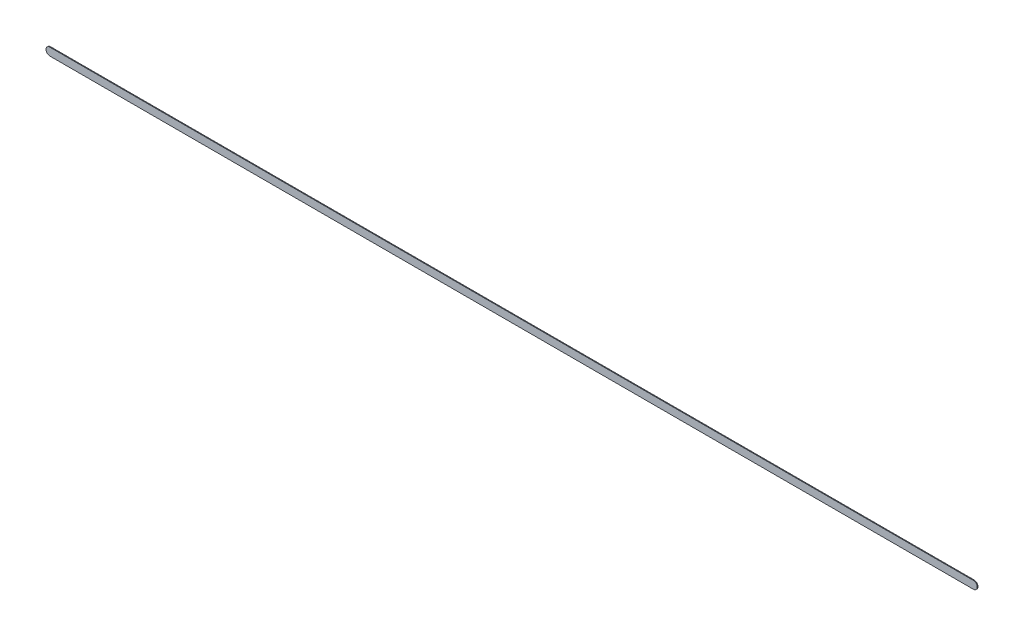
ISO-10303-21;
HEADER;
FILE_DESCRIPTION(('STEP AP214'),'2;1');
FILE_NAME('part.step','',(''),(''),'','','');
FILE_SCHEMA(('AUTOMOTIVE_DESIGN { 1 0 10303 214 1 1 1 1 }'));
ENDSEC;
DATA;
#1=APPLICATION_CONTEXT('core data for automotive mechanical design processes');
#2=APPLICATION_PROTOCOL_DEFINITION('international standard','automotive_design',2000,#1);
#3=PRODUCT_CONTEXT('',#1,'mechanical');
#4=PRODUCT('Part','Part','',(#3));
#5=PRODUCT_RELATED_PRODUCT_CATEGORY('part','',(#4));
#6=PRODUCT_DEFINITION_FORMATION('','',#4);
#7=PRODUCT_DEFINITION_CONTEXT('part definition',#1,'design');
#8=PRODUCT_DEFINITION('design','',#6,#7);
#9=PRODUCT_DEFINITION_SHAPE('','',#8);
#10=(LENGTH_UNIT() NAMED_UNIT(*) SI_UNIT(.MILLI.,.METRE.));
#11=(NAMED_UNIT(*) PLANE_ANGLE_UNIT() SI_UNIT($,.RADIAN.));
#12=(NAMED_UNIT(*) SI_UNIT($,.STERADIAN.) SOLID_ANGLE_UNIT());
#13=UNCERTAINTY_MEASURE_WITH_UNIT(LENGTH_MEASURE(1.E-05),#10,'distance_accuracy_value','');
#14=(GEOMETRIC_REPRESENTATION_CONTEXT(3) GLOBAL_UNCERTAINTY_ASSIGNED_CONTEXT((#13)) GLOBAL_UNIT_ASSIGNED_CONTEXT((#10,
#11,#12)) REPRESENTATION_CONTEXT('',''));
#15=CARTESIAN_POINT('',(0.,0.,0.));
#16=DIRECTION('',(0.,0.,1.));
#17=DIRECTION('',(1.,0.,0.));
#18=AXIS2_PLACEMENT_3D('',#15,#16,#17);
#19=CARTESIAN_POINT('',(31.987498780831,40.574998779297,1.1723000001));
#20=DIRECTION('',(0.,0.,1.));
#21=DIRECTION('',(1.,0.,0.));
#22=AXIS2_PLACEMENT_3D('',#19,#20,#21);
#23=PLANE('',#22);
#24=CARTESIAN_POINT('',(24.387498779297,40.574998779297,1.1723000001));
#25=DIRECTION('',(0.,0.,-1.));
#26=DIRECTION('',(1.,0.,0.));
#27=AXIS2_PLACEMENT_3D('',#24,#25,#26);
#28=CIRCLE('',#27,0.06349975587111);
#29=CARTESIAN_POINT('',(24.387499389648,40.511499023438,1.1723000001));
#30=VERTEX_POINT('',#29);
#31=CARTESIAN_POINT('',(24.387498779297,40.638498535162,1.1723000001));
#32=VERTEX_POINT('',#31);
#33=EDGE_CURVE('E47',#30,#32,#28,.T.);
#34=ORIENTED_EDGE('',*,*,#33,.F.);
#35=DIRECTION('',(1.,0.,0.));
#36=VECTOR('',#35,1.);
#37=CARTESIAN_POINT('',(39.5875,40.511499023438,1.1723000001));
#38=LINE('',#37,#36);
#39=CARTESIAN_POINT('',(39.587499389648,40.511499023438,1.1723000001));
#40=VERTEX_POINT('',#39);
#41=EDGE_CURVE('E103',#30,#40,#38,.T.);
#42=ORIENTED_EDGE('',*,*,#41,.T.);
#43=CARTESIAN_POINT('',(39.587498779297,40.574998779297,1.1723000001));
#44=DIRECTION('',(0.,0.,1.));
#45=DIRECTION('',(1.,0.,0.));
#46=AXIS2_PLACEMENT_3D('',#43,#44,#45);
#47=CIRCLE('',#46,0.06349975587111);
#48=CARTESIAN_POINT('',(39.650998535168,40.574998779297,1.1723000001));
#49=VERTEX_POINT('',#48);
#50=EDGE_CURVE('E102',#40,#49,#47,.T.);
#51=ORIENTED_EDGE('',*,*,#50,.T.);
#52=CARTESIAN_POINT('',(39.587498779297,40.574998779297,1.1723000001));
#53=DIRECTION('',(0.,0.,1.));
#54=DIRECTION('',(1.,0.,0.));
#55=AXIS2_PLACEMENT_3D('',#52,#53,#54);
#56=CIRCLE('',#55,0.06349975587111);
#57=CARTESIAN_POINT('',(39.587499389648,40.638498535156,1.1723000001));
#58=VERTEX_POINT('',#57);
#59=EDGE_CURVE('E91',#49,#58,#56,.T.);
#60=ORIENTED_EDGE('',*,*,#59,.T.);
#61=DIRECTION('',(-1.,0.,0.));
#62=VECTOR('',#61,1.);
#63=CARTESIAN_POINT('',(24.3875,40.638498535156,1.1723000001));
#64=LINE('',#63,#62);
#65=EDGE_CURVE('E11',#58,#32,#64,.T.);
#66=ORIENTED_EDGE('',*,*,#65,.T.);
#67=EDGE_LOOP('',(#34,#42,#51,#60,#66));
#68=FACE_BOUND('',#67,.T.);
#69=ADVANCED_FACE('F17',(#68),#23,.T.);
#70=CARTESIAN_POINT('',(24.3875,40.638498535156,1.1596000001));
#71=DIRECTION('',(0.,-1.,0.));
#72=DIRECTION('',(0.,0.,-1.));
#73=AXIS2_PLACEMENT_3D('',#70,#71,#72);
#74=PLANE('',#73);
#75=DIRECTION('',(0.,0.,1.));
#76=VECTOR('',#75,1.);
#77=CARTESIAN_POINT('',(39.5875,40.638498535156,1.1596000001));
#78=LINE('',#77,#76);
#79=CARTESIAN_POINT('',(39.587499389648,40.638498535156,1.1596000001));
#80=VERTEX_POINT('',#79);
#81=EDGE_CURVE('E97',#80,#58,#78,.T.);
#82=ORIENTED_EDGE('',*,*,#81,.F.);
#83=DIRECTION('',(-1.,0.,0.));
#84=VECTOR('',#83,1.);
#85=CARTESIAN_POINT('',(31.987498780831,40.638498535156,1.1596000001));
#86=LINE('',#85,#84);
#87=CARTESIAN_POINT('',(24.387498779297,40.638498535162,1.1596000001));
#88=VERTEX_POINT('',#87);
#89=EDGE_CURVE('E136',#80,#88,#86,.T.);
#90=ORIENTED_EDGE('',*,*,#89,.T.);
#91=DIRECTION('',(0.,0.,-1.));
#92=VECTOR('',#91,1.);
#93=CARTESIAN_POINT('',(24.387498779297,40.638498535168,1.1596000001));
#94=LINE('',#93,#92);
#95=EDGE_CURVE('E21',#32,#88,#94,.T.);
#96=ORIENTED_EDGE('',*,*,#95,.F.);
#97=ORIENTED_EDGE('',*,*,#65,.F.);
#98=EDGE_LOOP('',(#82,#90,#96,#97));
#99=FACE_BOUND('',#98,.T.);
#100=ADVANCED_FACE('F160',(#99),#74,.F.);
#101=CARTESIAN_POINT('',(24.387498779297,40.574998779297,1.1596000001));
#102=DIRECTION('',(0.,0.,1.));
#103=DIRECTION('',(1.,0.,0.));
#104=AXIS2_PLACEMENT_3D('',#101,#102,#103);
#105=CYLINDRICAL_SURFACE('',#104,0.06349975587111);
#106=DIRECTION('',(0.,0.,1.));
#107=VECTOR('',#106,1.);
#108=CARTESIAN_POINT('',(24.3875,40.511499023438,1.1596000001));
#109=LINE('',#108,#107);
#110=CARTESIAN_POINT('',(24.387499389648,40.511499023438,1.1596000001));
#111=VERTEX_POINT('',#110);
#112=EDGE_CURVE('E99',#111,#30,#109,.T.);
#113=ORIENTED_EDGE('',*,*,#112,.T.);
#114=ORIENTED_EDGE('',*,*,#33,.T.);
#115=ORIENTED_EDGE('',*,*,#95,.T.);
#116=CARTESIAN_POINT('',(24.387498779297,40.574998779297,1.1596000001));
#117=DIRECTION('',(0.,0.,1.));
#118=DIRECTION('',(1.,0.,0.));
#119=AXIS2_PLACEMENT_3D('',#116,#117,#118);
#120=CIRCLE('',#119,0.06349975587111);
#121=EDGE_CURVE('E135',#88,#111,#120,.T.);
#122=ORIENTED_EDGE('',*,*,#121,.T.);
#123=EDGE_LOOP('',(#113,#114,#115,#122));
#124=FACE_BOUND('',#123,.T.);
#125=ADVANCED_FACE('F19',(#124),#105,.T.);
#126=CARTESIAN_POINT('',(39.5875,40.511499023438,1.1596000001));
#127=DIRECTION('',(0.,1.,0.));
#128=DIRECTION('',(1.,0.,0.));
#129=AXIS2_PLACEMENT_3D('',#126,#127,#128);
#130=PLANE('',#129);
#131=ORIENTED_EDGE('',*,*,#112,.F.);
#132=DIRECTION('',(1.,0.,0.));
#133=VECTOR('',#132,1.);
#134=CARTESIAN_POINT('',(31.987498780831,40.511499023438,1.1596000001));
#135=LINE('',#134,#133);
#136=CARTESIAN_POINT('',(39.587499389648,40.511499023438,1.1596000001));
#137=VERTEX_POINT('',#136);
#138=EDGE_CURVE('E75',#111,#137,#135,.T.);
#139=ORIENTED_EDGE('',*,*,#138,.T.);
#140=DIRECTION('',(0.,0.,-1.));
#141=VECTOR('',#140,1.);
#142=CARTESIAN_POINT('',(39.5875,40.511499023438,1.1596000001));
#143=LINE('',#142,#141);
#144=EDGE_CURVE('E106',#40,#137,#143,.T.);
#145=ORIENTED_EDGE('',*,*,#144,.F.);
#146=ORIENTED_EDGE('',*,*,#41,.F.);
#147=EDGE_LOOP('',(#131,#139,#145,#146));
#148=FACE_BOUND('',#147,.T.);
#149=ADVANCED_FACE('F156',(#148),#130,.F.);
#150=CARTESIAN_POINT('',(39.587498779297,40.574998779297,1.1596000001));
#151=DIRECTION('',(0.,0.,1.));
#152=DIRECTION('',(1.,0.,0.));
#153=AXIS2_PLACEMENT_3D('',#150,#151,#152);
#154=CYLINDRICAL_SURFACE('',#153,0.06349975587111);
#155=DIRECTION('',(0.,0.,1.));
#156=VECTOR('',#155,1.);
#157=CARTESIAN_POINT('',(39.650998535168,40.574998779297,1.1596000001));
#158=LINE('',#157,#156);
#159=CARTESIAN_POINT('',(39.650998535168,40.574998779297,1.1596000001));
#160=VERTEX_POINT('',#159);
#161=EDGE_CURVE('E95',#160,#49,#158,.T.);
#162=ORIENTED_EDGE('',*,*,#161,.F.);
#163=CARTESIAN_POINT('',(39.587498779297,40.574998779297,1.1596000001));
#164=DIRECTION('',(0.,0.,1.));
#165=DIRECTION('',(1.,0.,0.));
#166=AXIS2_PLACEMENT_3D('',#163,#164,#165);
#167=CIRCLE('',#166,0.06349975587111);
#168=EDGE_CURVE('E85',#160,#80,#167,.T.);
#169=ORIENTED_EDGE('',*,*,#168,.T.);
#170=ORIENTED_EDGE('',*,*,#81,.T.);
#171=ORIENTED_EDGE('',*,*,#59,.F.);
#172=EDGE_LOOP('',(#162,#169,#170,#171));
#173=FACE_BOUND('',#172,.T.);
#174=ADVANCED_FACE('F93',(#173),#154,.T.);
#175=CARTESIAN_POINT('',(31.987498780831,40.574998779297,1.1596000001));
#176=DIRECTION('',(0.,0.,1.));
#177=DIRECTION('',(1.,0.,0.));
#178=AXIS2_PLACEMENT_3D('',#175,#176,#177);
#179=PLANE('',#178);
#180=ORIENTED_EDGE('',*,*,#138,.F.);
#181=ORIENTED_EDGE('',*,*,#121,.F.);
#182=ORIENTED_EDGE('',*,*,#89,.F.);
#183=ORIENTED_EDGE('',*,*,#168,.F.);
#184=CARTESIAN_POINT('',(39.587498779297,40.574998779297,1.1596000001));
#185=DIRECTION('',(0.,0.,1.));
#186=DIRECTION('',(1.,0.,0.));
#187=AXIS2_PLACEMENT_3D('',#184,#185,#186);
#188=CIRCLE('',#187,0.06349975587111);
#189=EDGE_CURVE('E109',#137,#160,#188,.T.);
#190=ORIENTED_EDGE('',*,*,#189,.F.);
#191=EDGE_LOOP('',(#180,#181,#182,#183,#190));
#192=FACE_BOUND('',#191,.T.);
#193=ADVANCED_FACE('F146',(#192),#179,.F.);
#194=CARTESIAN_POINT('',(39.587498779297,40.574998779297,1.1596000001));
#195=DIRECTION('',(0.,0.,1.));
#196=DIRECTION('',(1.,0.,0.));
#197=AXIS2_PLACEMENT_3D('',#194,#195,#196);
#198=CYLINDRICAL_SURFACE('',#197,0.06349975587111);
#199=ORIENTED_EDGE('',*,*,#189,.T.);
#200=ORIENTED_EDGE('',*,*,#161,.T.);
#201=ORIENTED_EDGE('',*,*,#50,.F.);
#202=ORIENTED_EDGE('',*,*,#144,.T.);
#203=EDGE_LOOP('',(#199,#200,#201,#202));
#204=FACE_BOUND('',#203,.T.);
#205=ADVANCED_FACE('F108',(#204),#198,.T.);
#206=CLOSED_SHELL('',(#69,#100,#125,#149,#174,#193,#205));
#207=MANIFOLD_SOLID_BREP('B1',#206);
#208=ADVANCED_BREP_SHAPE_REPRESENTATION('',(#18,#207),#14);
#209=SHAPE_DEFINITION_REPRESENTATION(#9,#208);
ENDSEC;
END-ISO-10303-21;
